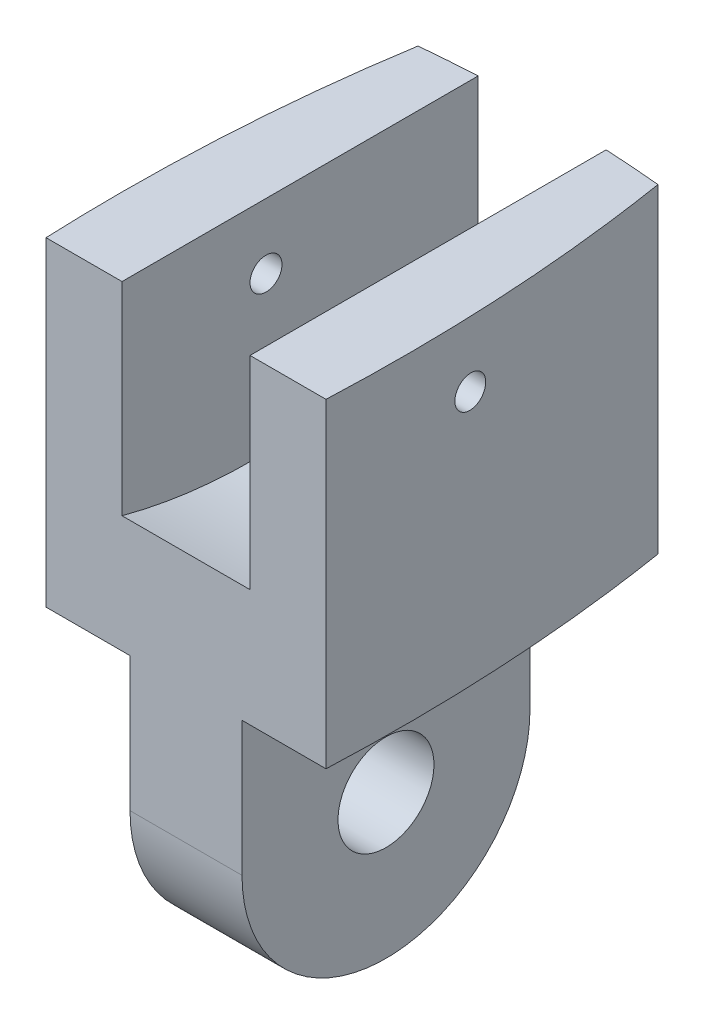
ISO-10303-21;
HEADER;
FILE_DESCRIPTION(('STEP AP214'),'2;1');
FILE_NAME('part.step','',(''),(''),'','','');
FILE_SCHEMA(('AUTOMOTIVE_DESIGN { 1 0 10303 214 1 1 1 1 }'));
ENDSEC;
DATA;
#1=APPLICATION_CONTEXT('core data for automotive mechanical design processes');
#2=APPLICATION_PROTOCOL_DEFINITION('international standard','automotive_design',2000,#1);
#3=PRODUCT_CONTEXT('',#1,'mechanical');
#4=PRODUCT('Part','Part','',(#3));
#5=PRODUCT_RELATED_PRODUCT_CATEGORY('part','',(#4));
#6=PRODUCT_DEFINITION_FORMATION('','',#4);
#7=PRODUCT_DEFINITION_CONTEXT('part definition',#1,'design');
#8=PRODUCT_DEFINITION('design','',#6,#7);
#9=PRODUCT_DEFINITION_SHAPE('','',#8);
#10=(LENGTH_UNIT() NAMED_UNIT(*) SI_UNIT(.MILLI.,.METRE.));
#11=(NAMED_UNIT(*) PLANE_ANGLE_UNIT() SI_UNIT($,.RADIAN.));
#12=(NAMED_UNIT(*) SI_UNIT($,.STERADIAN.) SOLID_ANGLE_UNIT());
#13=UNCERTAINTY_MEASURE_WITH_UNIT(LENGTH_MEASURE(1.E-05),#10,'distance_accuracy_value','');
#14=(GEOMETRIC_REPRESENTATION_CONTEXT(3) GLOBAL_UNCERTAINTY_ASSIGNED_CONTEXT((#13)) GLOBAL_UNIT_ASSIGNED_CONTEXT((#10,
#11,#12)) REPRESENTATION_CONTEXT('',''));
#15=CARTESIAN_POINT('',(0.,0.,0.));
#16=DIRECTION('',(0.,0.,1.));
#17=DIRECTION('',(1.,0.,0.));
#18=AXIS2_PLACEMENT_3D('',#15,#16,#17);
#19=CARTESIAN_POINT('',(5.13448278815076,0.,-21.0597227026028));
#20=DIRECTION('',(0.,-1.,0.));
#21=DIRECTION('',(0.,0.,-1.));
#22=AXIS2_PLACEMENT_3D('',#19,#20,#21);
#23=PLANE('',#22);
#24=DIRECTION('',(0.,0.,-1.));
#25=VECTOR('',#24,1.);
#26=CARTESIAN_POINT('',(4.,0.,-21.0597227026028));
#27=LINE('',#26,#25);
#28=CARTESIAN_POINT('',(4.,0.,11.8461538502491));
#29=VERTEX_POINT('',#28);
#30=CARTESIAN_POINT('',(4.,0.,-10.4123193736881));
#31=VERTEX_POINT('',#30);
#32=EDGE_CURVE('E211',#29,#31,#27,.T.);
#33=ORIENTED_EDGE('',*,*,#32,.F.);
#34=CARTESIAN_POINT('',(-8.75,0.,11.8461538461538));
#35=CARTESIAN_POINT('',(0.,0.,11.8461538461538));
#36=CARTESIAN_POINT('',(8.75,0.,11.8461538461538));
#37=B_SPLINE_CURVE_WITH_KNOTS('',2,(#34,#35,#36),.UNSPECIFIED.,.F.,.F.,(3,3),(0.,1.),.UNSPECIFIED.);
#38=CARTESIAN_POINT('',(8.75,0.,11.8461538461538));
#39=VERTEX_POINT('',#38);
#40=EDGE_CURVE('E318',#29,#39,#37,.T.);
#41=ORIENTED_EDGE('',*,*,#40,.T.);
#42=CARTESIAN_POINT('',(-960490.686997986,0.,278640.197183969));
#43=CARTESIAN_POINT('',(964287.125941009,0.,-264898.844652597));
#44=CARTESIAN_POINT('',(-968063.02695288,0.,251073.253230415));
#45=B_SPLINE_CURVE_WITH_KNOTS('',2,(#42,#43,#44),.UNSPECIFIED.,.F.,.F.,(3,3),(0.,1.),.UNSPECIFIED.);
#46=CARTESIAN_POINT('',(7.49999999989744,0.,-10.1538461531278));
#47=VERTEX_POINT('',#46);
#48=EDGE_CURVE('E312',#39,#47,#45,.T.);
#49=ORIENTED_EDGE('',*,*,#48,.T.);
#50=CARTESIAN_POINT('',(12478.8672852956,0.,999989.484933508));
#51=CARTESIAN_POINT('',(0.,0.,-1000010.51506649));
#52=CARTESIAN_POINT('',(-12478.8672852956,0.,999989.484933508));
#53=B_SPLINE_CURVE_WITH_KNOTS('',2,(#50,#51,#52),.UNSPECIFIED.,.F.,.F.,(3,3),(0.,1.),.UNSPECIFIED.);
#54=EDGE_CURVE('E311',#47,#31,#53,.T.);
#55=ORIENTED_EDGE('',*,*,#54,.T.);
#56=EDGE_LOOP('',(#33,#41,#49,#55));
#57=FACE_BOUND('',#56,.T.);
#58=ADVANCED_FACE('F119',(#57),#23,.F.);
#59=CARTESIAN_POINT('',(5.13448278817918,-20.,-21.059722702617));
#60=DIRECTION('',(0.,-1.,0.));
#61=DIRECTION('',(0.,0.,-1.));
#62=AXIS2_PLACEMENT_3D('',#59,#60,#61);
#63=PLANE('',#62);
#64=DIRECTION('',(0.,0.,1.));
#65=VECTOR('',#64,1.);
#66=CARTESIAN_POINT('',(3.5,-20.,-21.059722702617));
#67=LINE('',#66,#65);
#68=CARTESIAN_POINT('',(3.5,-20.,-6.15384615384616));
#69=VERTEX_POINT('',#68);
#70=CARTESIAN_POINT('',(3.5,-20.,11.8461538461538));
#71=VERTEX_POINT('',#70);
#72=EDGE_CURVE('E544',#69,#71,#67,.T.);
#73=ORIENTED_EDGE('',*,*,#72,.F.);
#74=DIRECTION('',(-1.,0.,0.));
#75=VECTOR('',#74,1.);
#76=CARTESIAN_POINT('',(5.13448278817918,-20.,-6.15384615384616));
#77=LINE('',#76,#75);
#78=CARTESIAN_POINT('',(-3.5,-20.,-6.15384615384616));
#79=VERTEX_POINT('',#78);
#80=EDGE_CURVE('E489',#69,#79,#77,.T.);
#81=ORIENTED_EDGE('',*,*,#80,.T.);
#82=DIRECTION('',(0.,0.,1.));
#83=VECTOR('',#82,1.);
#84=CARTESIAN_POINT('',(-3.5,-20.,-21.059722702617));
#85=LINE('',#84,#83);
#86=CARTESIAN_POINT('',(-3.5,-20.,11.8461538514346));
#87=VERTEX_POINT('',#86);
#88=EDGE_CURVE('E545',#79,#87,#85,.T.);
#89=ORIENTED_EDGE('',*,*,#88,.T.);
#90=CARTESIAN_POINT('',(-8.75,-20.,11.8461538461538));
#91=CARTESIAN_POINT('',(0.,-20.,11.8461538461538));
#92=CARTESIAN_POINT('',(8.75,-20.,11.8461538461538));
#93=B_SPLINE_CURVE_WITH_KNOTS('',2,(#90,#91,#92),.UNSPECIFIED.,.F.,.F.,(3,3),(0.,1.),.UNSPECIFIED.);
#94=CARTESIAN_POINT('',(-8.74999999920187,-20.,11.8461538612578));
#95=VERTEX_POINT('',#94);
#96=EDGE_CURVE('E472',#95,#87,#93,.T.);
#97=ORIENTED_EDGE('',*,*,#96,.F.);
#98=CARTESIAN_POINT('',(968063.026952878,-20.,251073.253230421));
#99=CARTESIAN_POINT('',(-964287.125941009,-20.,-264898.844652599));
#100=CARTESIAN_POINT('',(960490.686997987,-20.,278640.197183966));
#101=B_SPLINE_CURVE_WITH_KNOTS('',2,(#98,#99,#100),.UNSPECIFIED.,.F.,.F.,(3,3),(0.,1.),.UNSPECIFIED.);
#102=CARTESIAN_POINT('',(-7.50000000402118,-20.,-10.1538461277513));
#103=VERTEX_POINT('',#102);
#104=EDGE_CURVE('E534',#103,#95,#101,.T.);
#105=ORIENTED_EDGE('',*,*,#104,.F.);
#106=CARTESIAN_POINT('',(12478.8672852942,-20.,999989.484933508));
#107=CARTESIAN_POINT('',(-6.00408611717285E-10,-20.,-1000010.51506649));
#108=CARTESIAN_POINT('',(-12478.867285293,-20.,999989.484933508));
#109=B_SPLINE_CURVE_WITH_KNOTS('',2,(#106,#107,#108),.UNSPECIFIED.,.F.,.F.,(3,3),(0.,1.),.UNSPECIFIED.);
#110=CARTESIAN_POINT('',(7.50000000610207,-20.,-10.1538461533065));
#111=VERTEX_POINT('',#110);
#112=EDGE_CURVE('E527',#111,#103,#109,.T.);
#113=ORIENTED_EDGE('',*,*,#112,.F.);
#114=CARTESIAN_POINT('',(-960490.686997987,-20.,278640.197183966));
#115=CARTESIAN_POINT('',(964287.125941009,-20.,-264898.844652599));
#116=CARTESIAN_POINT('',(-968063.026952878,-20.,251073.253230421));
#117=B_SPLINE_CURVE_WITH_KNOTS('',2,(#114,#115,#116),.UNSPECIFIED.,.F.,.F.,(3,3),(0.,1.),.UNSPECIFIED.);
#118=CARTESIAN_POINT('',(8.74999999920187,-20.,11.8461538612578));
#119=VERTEX_POINT('',#118);
#120=EDGE_CURVE('E521',#119,#111,#117,.T.);
#121=ORIENTED_EDGE('',*,*,#120,.F.);
#122=EDGE_CURVE('E335',#71,#119,#93,.T.);
#123=ORIENTED_EDGE('',*,*,#122,.F.);
#124=EDGE_LOOP('',(#73,#81,#89,#97,#105,#113,#121,#123));
#125=FACE_BOUND('',#124,.T.);
#126=ADVANCED_FACE('F495',(#125),#63,.T.);
#127=CARTESIAN_POINT('',(-8.7499999991521,0.,11.8461538612444));
#128=VERTEX_POINT('',#127);
#129=CARTESIAN_POINT('',(-4.,0.,11.8461538571464));
#130=VERTEX_POINT('',#129);
#131=EDGE_CURVE('E302',#128,#130,#37,.T.);
#132=ORIENTED_EDGE('',*,*,#131,.T.);
#133=DIRECTION('',(0.,0.,-1.));
#134=VECTOR('',#133,1.);
#135=CARTESIAN_POINT('',(-4.,0.,-21.0597227026028));
#136=LINE('',#135,#134);
#137=CARTESIAN_POINT('',(-4.,0.,-10.4123193736881));
#138=VERTEX_POINT('',#137);
#139=EDGE_CURVE('E215',#130,#138,#136,.T.);
#140=ORIENTED_EDGE('',*,*,#139,.T.);
#141=CARTESIAN_POINT('',(-7.50000000385964,0.,-10.1538461284747));
#142=VERTEX_POINT('',#141);
#143=EDGE_CURVE('E298',#138,#142,#53,.T.);
#144=ORIENTED_EDGE('',*,*,#143,.T.);
#145=CARTESIAN_POINT('',(968063.02695288,0.,251073.253230415));
#146=CARTESIAN_POINT('',(-964287.125941009,0.,-264898.844652597));
#147=CARTESIAN_POINT('',(960490.686997986,0.,278640.197183969));
#148=B_SPLINE_CURVE_WITH_KNOTS('',2,(#145,#146,#147),.UNSPECIFIED.,.F.,.F.,(3,3),(0.,1.),.UNSPECIFIED.);
#149=EDGE_CURVE('E407',#142,#128,#148,.T.);
#150=ORIENTED_EDGE('',*,*,#149,.T.);
#151=EDGE_LOOP('',(#132,#140,#144,#150));
#152=FACE_BOUND('',#151,.T.);
#153=ADVANCED_FACE('F297',(#152),#23,.F.);
#154=CARTESIAN_POINT('',(-7.50000000625328,0.,-10.1538461533204));
#155=CARTESIAN_POINT('',(-7.50000000632861,-6.66666666666667,-10.1538461533037));
#156=CARTESIAN_POINT('',(-7.50000000640394,-13.3333333333333,-10.1538461532869));
#157=CARTESIAN_POINT('',(-7.50000000647927,-20.,-10.1538461532702));
#158=CARTESIAN_POINT('',(-6.8769188092913,0.,-10.2138647135521));
#159=CARTESIAN_POINT('',(-6.87691880937018,-6.66666666666667,-10.2138647135356));
#160=CARTESIAN_POINT('',(-6.87691880944906,-13.3333333333333,-10.2138647135191));
#161=CARTESIAN_POINT('',(-6.87691880952795,-20.,-10.2138647135026));
#162=CARTESIAN_POINT('',(-5.62932926094739,0.,-10.319078272971));
#163=CARTESIAN_POINT('',(-5.6293292610432,-6.66666666666666,-10.3190782729543));
#164=CARTESIAN_POINT('',(-5.62932926113901,-13.3333333333333,-10.3190782729376));
#165=CARTESIAN_POINT('',(-5.62932926123482,-20.,-10.319078272921));
#166=CARTESIAN_POINT('',(-3.75470153379456,0.,-10.4320674775611));
#167=CARTESIAN_POINT('',(-3.75470153391217,-6.66666666666667,-10.4320674775459));
#168=CARTESIAN_POINT('',(-3.75470153402977,-13.3333333333333,-10.4320674775306));
#169=CARTESIAN_POINT('',(-3.75470153414738,-20.,-10.4320674775154));
#170=CARTESIAN_POINT('',(-1.87789677760482,0.,-10.4999664647088));
#171=CARTESIAN_POINT('',(-1.87789677770733,-6.66666666666667,-10.4999664646972));
#172=CARTESIAN_POINT('',(-1.87789677780984,-13.3333333333333,-10.4999664646856));
#173=CARTESIAN_POINT('',(-1.87789677791236,-20.,-10.499966464674));
#174=CARTESIAN_POINT('',(-0.625965179133411,0.,-10.5150664921041));
#175=CARTESIAN_POINT('',(-0.625965179179066,-6.66666666666667,-10.5150664920946));
#176=CARTESIAN_POINT('',(-0.62596517922472,-13.3333333333333,-10.5150664920851));
#177=CARTESIAN_POINT('',(-0.625965179270374,-20.,-10.5150664920757));
#178=CARTESIAN_POINT('',(0.625965178984057,0.,-10.5150664921041));
#179=CARTESIAN_POINT('',(0.62596517902964,-6.66666666666667,-10.5150664920946));
#180=CARTESIAN_POINT('',(0.625965179075224,-13.3333333333333,-10.5150664920851));
#181=CARTESIAN_POINT('',(0.625965179120807,-20.,-10.5150664920757));
#182=CARTESIAN_POINT('',(1.87789637569051,0.,-10.4999664647873));
#183=CARTESIAN_POINT('',(1.87789637590126,-6.66666666666667,-10.4999664647754));
#184=CARTESIAN_POINT('',(1.877896376112,-13.3333333333333,-10.4999664647634));
#185=CARTESIAN_POINT('',(1.87789637632274,-20.,-10.4999664647514));
#186=CARTESIAN_POINT('',(3.75469993360539,0.,-10.4320675560397));
#187=CARTESIAN_POINT('',(3.75469993416297,-6.66666666666667,-10.4320675560062));
#188=CARTESIAN_POINT('',(3.75469993472056,-13.3333333333333,-10.4320675559727));
#189=CARTESIAN_POINT('',(3.75469993527815,-20.,-10.4320675559392));
#190=CARTESIAN_POINT('',(5.62933049547368,0.,-10.3190782037758));
#191=CARTESIAN_POINT('',(5.62933049635484,-6.66666666666666,-10.3190782037048));
#192=CARTESIAN_POINT('',(5.629330497236,-13.3333333333333,-10.3190782036338));
#193=CARTESIAN_POINT('',(5.62933049811716,-20.,-10.3190782035628));
#194=CARTESIAN_POINT('',(6.8769188062687,0.,-10.2138647138176));
#195=CARTESIAN_POINT('',(6.87691880726889,-6.66666666666667,-10.2138647137199));
#196=CARTESIAN_POINT('',(6.87691880826909,-13.3333333333333,-10.2138647136222));
#197=CARTESIAN_POINT('',(6.87691880926928,-20.,-10.2138647135245));
#198=CARTESIAN_POINT('',(7.49999999989744,0.,-10.1538461531278));
#199=CARTESIAN_POINT('',(7.49999999995914,-6.66666666666667,-10.1538461528579));
#200=CARTESIAN_POINT('',(7.50000000002084,-13.3333333333333,-10.1538461525881));
#201=CARTESIAN_POINT('',(7.50000000008254,-20.,-10.1538461523182));
#202=B_SPLINE_SURFACE_WITH_KNOTS('',3,3,((#154,#155,#156,#157),(#158,#159,#160,#161),(#162,#163,
#164,#165),(#166,#167,#168,#169),(#170,#171,#172,#173),(#174,#175,#176,#177),(#178,#179,#180,
#181),(#182,#183,#184,#185),(#186,#187,#188,#189),(#190,#191,#192,#193),(#194,#195,#196,#197),
(#198,#199,#200,#201)),.UNSPECIFIED.,.F.,.F.,.F.,(4,1,1,1,2,1,1,1,4),(4,4),(0.804050837385435,
0.828544482715185,0.853038128044935,0.877531773374684,0.902025418704434,0.926519064028326,
0.951012709352217,0.975506354676109,1.),(0.,1.),.UNSPECIFIED.);
#203=CARTESIAN_POINT('',(-4.,-13.9386610725496,-10.4123194402194));
#204=CARTESIAN_POINT('',(-4.,-11.6155508937913,-10.4123194402227));
#205=CARTESIAN_POINT('',(-4.,-9.29244071503304,-10.412319440226));
#206=CARTESIAN_POINT('',(-4.,-4.64622035751652,-10.4123194402326));
#207=CARTESIAN_POINT('',(-4.,-2.32311017875826,-10.4123194402359));
#208=CARTESIAN_POINT('',(-4.,0.,-10.4123194402392));
#209=B_SPLINE_CURVE_WITH_KNOTS('',3,(#203,#204,#205,#206,#207,#208),.UNSPECIFIED.,.F.,.F.,(4,2,
4),(0.,6.96933053627478,13.9386610725496),.UNSPECIFIED.);
#210=CARTESIAN_POINT('',(-4.,-10.4457546597033,-10.4123194402248));
#211=VERTEX_POINT('',#210);
#212=EDGE_CURVE('E230',#211,#138,#209,.T.);
#213=CARTESIAN_POINT('',(4.,-10.4457546625419,-10.412319434166));
#214=CARTESIAN_POINT('',(3.3348531414431,-10.4297265454407,-10.4464996853538));
#215=CARTESIAN_POINT('',(2.66917129305041,-10.417658036247,-10.4721657324565));
#216=CARTESIAN_POINT('',(1.33780678361818,-10.4015318103164,-10.5064146198566));
#217=CARTESIAN_POINT('',(0.672124552754392,-10.3974676665625,-10.5150111659667));
#218=CARTESIAN_POINT('',(-0.661387095742275,-10.3974156466644,-10.5151214626701));
#219=CARTESIAN_POINT('',(-1.32921651964448,-10.4014538394748,-10.5065800726149));
#220=CARTESIAN_POINT('',(-2.66487714336832,-10.4175800821299,-10.4723312830972));
#221=CARTESIAN_POINT('',(-3.33270791023366,-10.4296746215884,-10.4466100447384));
#222=CARTESIAN_POINT('',(-4.,-10.4457546597035,-10.4123194402244));
#223=B_SPLINE_CURVE_WITH_KNOTS('',3,(#213,#214,#215,#216,#217,#218,#219,#220,#221,#222),
.UNSPECIFIED.,.F.,.F.,(4,2,2,2,4),(0.,1.9985888549796,3.99557230981212,5.99899128492525,
8.00402602508887),.UNSPECIFIED.);
#224=CARTESIAN_POINT('',(4.,-10.4457546625417,-10.4123194341664));
#225=VERTEX_POINT('',#224);
#226=EDGE_CURVE('E220',#225,#211,#223,.T.);
#227=CARTESIAN_POINT('',(4.,-13.9386610725496,-10.412319434161));
#228=CARTESIAN_POINT('',(4.,-11.6155508937913,-10.4123194341643));
#229=CARTESIAN_POINT('',(4.,-9.29244071503304,-10.4123194341676));
#230=CARTESIAN_POINT('',(4.,-4.64622035751652,-10.4123194341742));
#231=CARTESIAN_POINT('',(4.,-2.32311017875826,-10.4123194341775));
#232=CARTESIAN_POINT('',(4.,0.,-10.4123194341808));
#233=B_SPLINE_CURVE_WITH_KNOTS('',3,(#227,#228,#229,#230,#231,#232),.UNSPECIFIED.,.F.,.F.,(4,2,
4),(0.,6.96933053627478,13.9386610725496),.UNSPECIFIED.);
#234=EDGE_CURVE('E208',#225,#31,#233,.T.);
#235=CARTESIAN_POINT('',(7.49999999989744,0.,-10.1538461531278));
#236=CARTESIAN_POINT('',(7.49999999995914,-6.66666666666667,-10.1538461528579));
#237=CARTESIAN_POINT('',(7.50000000002084,-13.3333333333333,-10.1538461525881));
#238=CARTESIAN_POINT('',(7.50000000008254,-20.,-10.1538461523182));
#239=B_SPLINE_CURVE_WITH_KNOTS('',3,(#235,#236,#237,#238),.UNSPECIFIED.,.F.,.F.,(4,4),(0.,1.),.UNSPECIFIED.);
#240=EDGE_CURVE('E326',#47,#111,#239,.T.);
#241=CARTESIAN_POINT('',(-7.50000000625328,0.,-10.1538461533204));
#242=CARTESIAN_POINT('',(-7.50000000632861,-6.66666666666667,-10.1538461533037));
#243=CARTESIAN_POINT('',(-7.50000000640394,-13.3333333333333,-10.1538461532869));
#244=CARTESIAN_POINT('',(-7.50000000647927,-20.,-10.1538461532702));
#245=B_SPLINE_CURVE_WITH_KNOTS('',3,(#241,#242,#243,#244),.UNSPECIFIED.,.F.,.F.,(4,4),(0.,1.),.UNSPECIFIED.);
#246=EDGE_CURVE('E309',#142,#103,#245,.T.);
#247=ORIENTED_EDGE('',*,*,#212,.F.);
#248=ORIENTED_EDGE('',*,*,#226,.F.);
#249=ORIENTED_EDGE('',*,*,#234,.T.);
#250=ORIENTED_EDGE('',*,*,#54,.F.);
#251=ORIENTED_EDGE('',*,*,#240,.T.);
#252=ORIENTED_EDGE('',*,*,#112,.T.);
#253=ORIENTED_EDGE('',*,*,#246,.F.);
#254=ORIENTED_EDGE('',*,*,#143,.F.);
#255=EDGE_LOOP('',(#247,#248,#249,#250,#251,#252,#253,#254));
#256=FACE_BOUND('',#255,.T.);
#257=ADVANCED_FACE('F228',(#256),#202,.T.);
#258=CARTESIAN_POINT('',(-8.74999999915212,0.,11.8461538612417));
#259=CARTESIAN_POINT('',(-8.74999999916522,-6.66666666666667,11.8461538612474));
#260=CARTESIAN_POINT('',(-8.74999999917832,-13.3333333333333,11.8461538612532));
#261=CARTESIAN_POINT('',(-8.74999999919142,-20.,11.8461538612589));
#262=CARTESIAN_POINT('',(-8.82839887033527,0.,9.96267175942704));
#263=CARTESIAN_POINT('',(-8.82839887034775,-6.66666666666667,9.96267175945363));
#264=CARTESIAN_POINT('',(-8.82839887036024,-13.3333333333333,9.96267175948022));
#265=CARTESIAN_POINT('',(-8.82839887037273,-20.,9.96267175950681));
#266=CARTESIAN_POINT('',(-8.89391384397283,0.,6.22078194046674));
#267=CARTESIAN_POINT('',(-8.89391384398609,-6.66666666666668,6.22078194053446));
#268=CARTESIAN_POINT('',(-8.89391384399936,-13.3333333333334,6.22078194060218));
#269=CARTESIAN_POINT('',(-8.89391384401263,-20.,6.2207819406699));
#270=CARTESIAN_POINT('',(-8.71833799824284,0.,0.683170366033025));
#271=CARTESIAN_POINT('',(-8.71833799826332,-6.66666666666666,0.683170366160794));
#272=CARTESIAN_POINT('',(-8.71833799828379,-13.3333333333333,0.683170366288564));
#273=CARTESIAN_POINT('',(-8.71833799830427,-20.,0.683170366416333));
#274=CARTESIAN_POINT('',(-8.26891384632663,0.,-4.77921805439389));
#275=CARTESIAN_POINT('',(-8.26891384636033,-6.66666666666666,-4.77921805420773));
#276=CARTESIAN_POINT('',(-8.26891384639403,-13.3333333333333,-4.77921805402157));
#277=CARTESIAN_POINT('',(-8.26891384642773,-20.,-4.77921805383541));
#278=CARTESIAN_POINT('',(-7.78673220759163,0.,-8.37066156534066));
#279=CARTESIAN_POINT('',(-7.78673220763816,-6.66666666666667,-8.37066156511668));
#280=CARTESIAN_POINT('',(-7.7867322076847,-13.3333333333333,-8.37066156489269));
#281=CARTESIAN_POINT('',(-7.78673220773123,-20.,-8.37066156466871));
#282=CARTESIAN_POINT('',(-7.50000000625328,0.,-10.1538461533204));
#283=CARTESIAN_POINT('',(-7.50000000632861,-6.66666666666667,-10.1538461533037));
#284=CARTESIAN_POINT('',(-7.50000000640394,-13.3333333333333,-10.1538461532869));
#285=CARTESIAN_POINT('',(-7.50000000647927,-20.,-10.1538461532702));
#286=B_SPLINE_SURFACE_WITH_KNOTS('',3,3,((#258,#259,#260,#261),(#262,#263,#264,#265),(#266,#267,
#268,#269),(#270,#271,#272,#273),(#274,#275,#276,#277),(#278,#279,#280,#281),(#282,#283,#284,
#285)),.UNSPECIFIED.,.F.,.F.,.F.,(4,1,1,1,4),(4,4),(0.516152851570945,0.588127348024568,
0.66010184447819,0.732076340931813,0.804050837385435),(0.,1.),.UNSPECIFIED.);
#287=CARTESIAN_POINT('',(-8.73199588802616,-4.07021301557208,1.84615384615384));
#288=CARTESIAN_POINT('',(-8.73199611095447,-4.1263486207463,1.84615768853024));
#289=CARTESIAN_POINT('',(-8.73221605370904,-4.18254273664591,1.85090296124685));
#290=CARTESIAN_POINT('',(-8.73286755761096,-4.2655822728275,1.86501947070341));
#291=CARTESIAN_POINT('',(-8.73313868082126,-4.29307568691622,1.87089915830496));
#292=CARTESIAN_POINT('',(-8.73378517980922,-4.34749587987484,1.88495444389628));
#293=CARTESIAN_POINT('',(-8.73416064716542,-4.37442213854088,1.89313205875208));
#294=CARTESIAN_POINT('',(-8.73543672321868,-4.45395192405377,1.92100964497264));
#295=CARTESIAN_POINT('',(-8.7364878884835,-4.50541690053934,1.94407324658259));
#296=CARTESIAN_POINT('',(-8.73894455891865,-4.60371759957563,1.99849049235292));
#297=CARTESIAN_POINT('',(-8.74035007330246,-4.65055320171338,2.02984435207025));
#298=CARTESIAN_POINT('',(-8.74345646056436,-4.73832625859891,2.09997684936209));
#299=CARTESIAN_POINT('',(-8.74515747989034,-4.7792607703602,2.1387591693543));
#300=CARTESIAN_POINT('',(-8.74878429894541,-4.85403907127963,2.22263613440035));
#301=CARTESIAN_POINT('',(-8.75071010858849,-4.88788254751584,2.26773105787809));
#302=CARTESIAN_POINT('',(-8.75471290600723,-4.9475518962301,2.36299927806206));
#303=CARTESIAN_POINT('',(-8.75679003439898,-4.97337019073952,2.41317731570978));
#304=CARTESIAN_POINT('',(-8.76101726108779,-5.0162152253759,2.51715296947016));
#305=CARTESIAN_POINT('',(-8.76316735953682,-5.03324194719071,2.57095059312186));
#306=CARTESIAN_POINT('',(-8.76746850568798,-5.05803001649822,2.68067563976032));
#307=CARTESIAN_POINT('',(-8.7696195531307,-5.06578549866404,2.73660438791591));
#308=CARTESIAN_POINT('',(-8.77385434882183,-5.07179063036411,2.84897239733114));
#309=CARTESIAN_POINT('',(-8.77593809714125,-5.07004028992871,2.90541165805203));
#310=CARTESIAN_POINT('',(-8.77998065289627,-5.05708146496697,3.01720040075864));
#311=CARTESIAN_POINT('',(-8.78193945597944,-5.04587265115214,3.07254984473468));
#312=CARTESIAN_POINT('',(-8.78568492784466,-5.01431224886005,3.18058392168385));
#313=CARTESIAN_POINT('',(-8.78747159677168,-4.99396066808312,3.23326855690134));
#314=CARTESIAN_POINT('',(-8.790835952892,-4.94470091531257,3.33445269435018));
#315=CARTESIAN_POINT('',(-8.79241372819625,-4.91579636769452,3.38295395809186));
#316=CARTESIAN_POINT('',(-8.79533544021839,-4.85024634586047,3.47441613677965));
#317=CARTESIAN_POINT('',(-8.79667937770609,-4.81360089712911,3.51737706996491));
#318=CARTESIAN_POINT('',(-8.79911592098645,-4.73363146353409,3.5965128226423));
#319=CARTESIAN_POINT('',(-8.80020866745199,-4.690311239519,3.63269143828741));
#320=CARTESIAN_POINT('',(-8.80213401508912,-4.59820668730483,3.69726243041943));
#321=CARTESIAN_POINT('',(-8.80296661688065,-4.54942237212722,3.72565482546113));
#322=CARTESIAN_POINT('',(-8.80436647097846,-4.44779855222996,3.77383368558323));
#323=CARTESIAN_POINT('',(-8.80493384414671,-4.39496090737425,3.79362407022227));
#324=CARTESIAN_POINT('',(-8.8058018510013,-4.28671118887174,3.82405441676674));
#325=CARTESIAN_POINT('',(-8.80610248513165,-4.23129911951054,3.83469439390411));
#326=CARTESIAN_POINT('',(-8.80643641355499,-4.11948903452482,3.84651947453735));
#327=CARTESIAN_POINT('',(-8.80646977757333,-4.06309127989362,3.84770704397463));
#328=CARTESIAN_POINT('',(-8.80626930855786,-3.95089692932639,3.84060001636578));
#329=CARTESIAN_POINT('',(-8.80603547570555,-3.89510033298203,3.83230542576066));
#330=CARTESIAN_POINT('',(-8.80530101241469,-3.78569592173915,3.8064709841581));
#331=CARTESIAN_POINT('',(-8.80480039947498,-3.73208796353021,3.7889317395433));
#332=CARTESIAN_POINT('',(-8.80353386853948,-3.62857823096242,3.7451073656325));
#333=CARTESIAN_POINT('',(-8.8027679505391,-3.57867645666778,3.71882223618498));
#334=CARTESIAN_POINT('',(-8.80097466907983,-3.48398868644011,3.65824997031047));
#335=CARTESIAN_POINT('',(-8.79994727363699,-3.43920331731818,3.62396185499967));
#336=CARTESIAN_POINT('',(-8.79763941984752,-3.35602497494901,3.54836037889885));
#337=CARTESIAN_POINT('',(-8.79635896108832,-3.31763201212358,3.50704700665549));
#338=CARTESIAN_POINT('',(-8.79355932247005,-3.24831450109412,3.41855474951323));
#339=CARTESIAN_POINT('',(-8.79204006587776,-3.21739236163086,3.37137398025693));
#340=CARTESIAN_POINT('',(-8.78878639220451,-3.16390730171193,3.27249790962546));
#341=CARTESIAN_POINT('',(-8.7870519748089,-3.14134439348052,3.22080260164851));
#342=CARTESIAN_POINT('',(-8.78340033033222,-3.10520567460887,3.11433775734541));
#343=CARTESIAN_POINT('',(-8.78148301162381,-3.09163439580504,3.0595666858774));
#344=CARTESIAN_POINT('',(-8.77751049015344,-3.07387938949361,2.94852831018031));
#345=CARTESIAN_POINT('',(-8.77545528667312,-3.06969571089846,2.89226099815687));
#346=CARTESIAN_POINT('',(-8.7712608071908,-3.07083285993268,2.77979455341137));
#347=CARTESIAN_POINT('',(-8.7691214854824,-3.07615892655987,2.72359547534912));
#348=CARTESIAN_POINT('',(-8.7648245065894,-3.09617388854944,2.61289050177356));
#349=CARTESIAN_POINT('',(-8.76266684931999,-3.11086282724722,2.55838461409829));
#350=CARTESIAN_POINT('',(-8.75840456629134,-3.14919317648088,2.4525945520974));
#351=CARTESIAN_POINT('',(-8.75629995860875,-3.17283759576516,2.40131146728676));
#352=CARTESIAN_POINT('',(-8.75222087037468,-3.22841026123508,2.30344405999905));
#353=CARTESIAN_POINT('',(-8.75024638470138,-3.26033818112469,2.2568595525403));
#354=CARTESIAN_POINT('',(-8.74650447861205,-3.3315588561184,2.16972385917326));
#355=CARTESIAN_POINT('',(-8.74473702026662,-3.37085025872129,2.12917156773631));
#356=CARTESIAN_POINT('',(-8.74148025525783,-3.45572011467693,2.05522919414231));
#357=CARTESIAN_POINT('',(-8.73999094111369,-3.50129839888458,2.02183891935687));
#358=CARTESIAN_POINT('',(-8.7380143469113,-3.57334755682958,1.97786812880016));
#359=CARTESIAN_POINT('',(-8.73739809410295,-3.59799301796585,1.9642241306863));
#360=CARTESIAN_POINT('',(-8.73625801169691,-3.64832286461461,1.93907069354241));
#361=CARTESIAN_POINT('',(-8.73573410107213,-3.67400631475131,1.92755938269445));
#362=CARTESIAN_POINT('',(-8.73431025499842,-3.75234375626874,1.89636009298913));
#363=CARTESIAN_POINT('',(-8.7335559804699,-3.80636556211856,1.87995758885869));
#364=CARTESIAN_POINT('',(-8.73267686557528,-3.89563713225548,1.8608827265593));
#365=CARTESIAN_POINT('',(-8.73242201480883,-3.93031497294107,1.8553672143009));
#366=CARTESIAN_POINT('',(-8.73208145641496,-4.00005859416616,1.84800157438203));
#367=CARTESIAN_POINT('',(-8.73199574868052,-4.03512437446019,1.84615144440248));
#368=CARTESIAN_POINT('',(-8.73199588802616,-4.07021301557208,1.84615384615384));
#369=B_SPLINE_CURVE_WITH_KNOTS('',3,(#287,#288,#289,#290,#291,#292,#293,#294,#295,#296,#297,
#298,#299,#300,#301,#302,#303,#304,#305,#306,#307,#308,#309,#310,#311,#312,#313,#314,#315,#316,
#317,#318,#319,#320,#321,#322,#323,#324,#325,#326,#327,#328,#329,#330,#331,#332,#333,#334,#335,
#336,#337,#338,#339,#340,#341,#342,#343,#344,#345,#346,#347,#348,#349,#350,#351,#352,#353,#354,
#355,#356,#357,#358,#359,#360,#361,#362,#363,#364,#365,#366,#367,#368),.UNSPECIFIED.,.T.,.F.,(4,
2,2,2,2,2,2,2,2,2,2,2,2,2,2,2,2,2,2,2,2,2,2,2,2,2,2,2,2,2,2,2,2,2,2,2,2,2,2,2,4),(0.,
0.168256630278762,0.252524170652635,0.336865904000102,0.505217523824589,0.673573521429838,
0.842013193054034,1.01046029622612,1.17906597973712,1.34767201443887,1.5163846591603,
1.6850971258595,1.85381546637798,2.02253366479637,2.1911804699137,2.35982671981972,
2.52837829250313,2.69692946351973,2.86540375244647,3.03387776092746,3.2023078165166,
3.37073775769514,3.53915665245848,3.70757555013933,3.8760150587535,4.04445484197914,
4.21294886125341,4.381443126927,4.55002225027418,4.71860225197133,4.88727515445207,
5.05594883762932,5.22467923998308,5.39340299687301,5.56209579343724,5.73078405229975,
5.81522675806103,5.89959499532573,6.06805133059047,6.17322344428883,6.27839549144543),.UNSPECIFIED.);
#370=CARTESIAN_POINT('',(-8.73199588802616,-4.07021301557208,1.84615384615384));
#371=VERTEX_POINT('',#370);
#372=EDGE_CURVE('E637',#371,#371,#369,.T.);
#373=CARTESIAN_POINT('',(-8.74999999915212,0.,11.8461538612417));
#374=CARTESIAN_POINT('',(-8.74999999916522,-6.66666666666667,11.8461538612474));
#375=CARTESIAN_POINT('',(-8.74999999917832,-13.3333333333333,11.8461538612532));
#376=CARTESIAN_POINT('',(-8.74999999919142,-20.,11.8461538612589));
#377=B_SPLINE_CURVE_WITH_KNOTS('',3,(#373,#374,#375,#376),.UNSPECIFIED.,.F.,.F.,(4,4),(0.,1.),.UNSPECIFIED.);
#378=EDGE_CURVE('E564',#128,#95,#377,.T.);
#379=ORIENTED_EDGE('',*,*,#372,.F.);
#380=EDGE_LOOP('',(#379));
#381=FACE_BOUND('',#380,.T.);
#382=ORIENTED_EDGE('',*,*,#149,.F.);
#383=ORIENTED_EDGE('',*,*,#246,.T.);
#384=ORIENTED_EDGE('',*,*,#104,.T.);
#385=ORIENTED_EDGE('',*,*,#378,.F.);
#386=EDGE_LOOP('',(#382,#383,#384,#385));
#387=FACE_BOUND('',#386,.T.);
#388=ADVANCED_FACE('F371',(#381,#387),#286,.T.);
#389=CARTESIAN_POINT('',(8.75,0.,11.8461538461538));
#390=DIRECTION('',(8.62161532684476E-10,0.,1.));
#391=DIRECTION('',(-1.,0.,8.62161532684476E-10));
#392=AXIS2_PLACEMENT_3D('',#389,#390,#391);
#393=PLANE('',#392);
#394=DIRECTION('',(0.,-1.,0.));
#395=VECTOR('',#394,1.);
#396=CARTESIAN_POINT('',(-4.,0.,11.8461538571464));
#397=LINE('',#396,#395);
#398=CARTESIAN_POINT('',(-4.,-12.6779096471664,11.8461538564559));
#399=VERTEX_POINT('',#398);
#400=EDGE_CURVE('E13',#130,#399,#397,.T.);
#401=ORIENTED_EDGE('',*,*,#400,.F.);
#402=ORIENTED_EDGE('',*,*,#131,.F.);
#403=ORIENTED_EDGE('',*,*,#378,.T.);
#404=ORIENTED_EDGE('',*,*,#96,.T.);
#405=DIRECTION('',(0.,-1.,0.));
#406=VECTOR('',#405,1.);
#407=CARTESIAN_POINT('',(-3.5,-28.3917436150871,11.8461538461538));
#408=LINE('',#407,#406);
#409=CARTESIAN_POINT('',(-3.5,-28.3917436150871,11.8461538461538));
#410=VERTEX_POINT('',#409);
#411=EDGE_CURVE('E145',#87,#410,#408,.T.);
#412=ORIENTED_EDGE('',*,*,#411,.T.);
#413=DIRECTION('',(-1.,0.,0.));
#414=VECTOR('',#413,1.);
#415=CARTESIAN_POINT('',(3.5,-28.3917436150871,11.8461538461538));
#416=LINE('',#415,#414);
#417=CARTESIAN_POINT('',(3.5,-28.3917436150871,11.8461538461538));
#418=VERTEX_POINT('',#417);
#419=EDGE_CURVE('E604',#418,#410,#416,.T.);
#420=ORIENTED_EDGE('',*,*,#419,.F.);
#421=DIRECTION('',(0.,-1.,0.));
#422=VECTOR('',#421,1.);
#423=CARTESIAN_POINT('',(3.5,-28.3917436150871,11.8461538461538));
#424=LINE('',#423,#422);
#425=EDGE_CURVE('E553',#71,#418,#424,.T.);
#426=ORIENTED_EDGE('',*,*,#425,.F.);
#427=ORIENTED_EDGE('',*,*,#122,.T.);
#428=CARTESIAN_POINT('',(8.75,0.,11.8461538461538));
#429=CARTESIAN_POINT('',(8.75,-6.66666666666667,11.8461538461538));
#430=CARTESIAN_POINT('',(8.75,-13.3333333333333,11.8461538461538));
#431=CARTESIAN_POINT('',(8.75,-20.,11.8461538461538));
#432=B_SPLINE_CURVE_WITH_KNOTS('',3,(#428,#429,#430,#431),.UNSPECIFIED.,.F.,.F.,(4,4),(0.,1.),.UNSPECIFIED.);
#433=EDGE_CURVE('E354',#39,#119,#432,.T.);
#434=ORIENTED_EDGE('',*,*,#433,.F.);
#435=ORIENTED_EDGE('',*,*,#40,.F.);
#436=DIRECTION('',(0.,-1.,0.));
#437=VECTOR('',#436,1.);
#438=CARTESIAN_POINT('',(4.,0.,11.8461538502491));
#439=LINE('',#438,#437);
#440=CARTESIAN_POINT('',(4.,-12.6779096490031,11.8461538502491));
#441=VERTEX_POINT('',#440);
#442=EDGE_CURVE('E456',#29,#441,#439,.T.);
#443=ORIENTED_EDGE('',*,*,#442,.T.);
#444=CARTESIAN_POINT('',(-4.,-12.6779096471664,11.8461538568011));
#445=CARTESIAN_POINT('',(-1.33333333333333,-12.6779096477174,11.8461538546171));
#446=CARTESIAN_POINT('',(1.33333333333333,-12.6779096482683,11.8461538524331));
#447=CARTESIAN_POINT('',(4.,-12.6779096488192,11.8461538502491));
#448=B_SPLINE_CURVE_WITH_KNOTS('',3,(#444,#445,#446,#447),.UNSPECIFIED.,.F.,.F.,(4,4),(0.,8.),.UNSPECIFIED.);
#449=EDGE_CURVE('E129',#399,#441,#448,.T.);
#450=ORIENTED_EDGE('',*,*,#449,.F.);
#451=EDGE_LOOP('',(#401,#402,#403,#404,#412,#420,#426,#427,#434,#435,#443,#450));
#452=FACE_BOUND('',#451,.T.);
#453=ADVANCED_FACE('F121',(#452),#393,.T.);
#454=CARTESIAN_POINT('',(7.49999999989744,0.,-10.1538461531278));
#455=CARTESIAN_POINT('',(7.49999999995914,-6.66666666666667,-10.1538461528579));
#456=CARTESIAN_POINT('',(7.50000000002084,-13.3333333333333,-10.1538461525881));
#457=CARTESIAN_POINT('',(7.50000000008254,-20.,-10.1538461523182));
#458=CARTESIAN_POINT('',(7.78673220438016,0.,-8.37066158805027));
#459=CARTESIAN_POINT('',(7.78673220443366,-6.66666666666667,-8.37066158780132));
#460=CARTESIAN_POINT('',(7.78673220448716,-13.3333333333333,-8.37066158755238));
#461=CARTESIAN_POINT('',(7.78673220454066,-20.,-8.37066158730343));
#462=CARTESIAN_POINT('',(8.26891384440654,0.,-4.77921807316861));
#463=CARTESIAN_POINT('',(8.2689138444459,-6.66666666666668,-4.77921807296207));
#464=CARTESIAN_POINT('',(8.26891384448525,-13.3333333333334,-4.77921807275552));
#465=CARTESIAN_POINT('',(8.26891384452461,-20.,-4.77921807254898));
#466=CARTESIAN_POINT('',(8.71833799762892,0.,0.683170353333955));
#467=CARTESIAN_POINT('',(8.71833799765382,-6.66666666666665,0.683170353475038));
#468=CARTESIAN_POINT('',(8.71833799767872,-13.3333333333333,0.68317035361612));
#469=CARTESIAN_POINT('',(8.71833799770362,-20.,0.683170353757203));
#470=CARTESIAN_POINT('',(8.89391384403416,0.,6.2207819340166));
#471=CARTESIAN_POINT('',(8.89391384405134,-6.66666666666668,6.22078193409037));
#472=CARTESIAN_POINT('',(8.89391384406852,-13.3333333333334,6.22078193416414));
#473=CARTESIAN_POINT('',(8.89391384408571,-20.,6.22078193423791));
#474=CARTESIAN_POINT('',(8.82839887042619,0.,9.96267175725841));
#475=CARTESIAN_POINT('',(8.82839887044274,-6.66666666666667,9.96267175728607));
#476=CARTESIAN_POINT('',(8.82839887045928,-13.3333333333333,9.96267175731372));
#477=CARTESIAN_POINT('',(8.82839887047582,-20.,9.96267175734138));
#478=CARTESIAN_POINT('',(8.75,0.,11.8461538461538));
#479=CARTESIAN_POINT('',(8.75,-6.66666666666667,11.8461538461538));
#480=CARTESIAN_POINT('',(8.75,-13.3333333333333,11.8461538461538));
#481=CARTESIAN_POINT('',(8.75,-20.,11.8461538461538));
#482=B_SPLINE_SURFACE_WITH_KNOTS('',3,3,((#454,#455,#456,#457),(#458,#459,#460,#461),(#462,#463,
#464,#465),(#466,#467,#468,#469),(#470,#471,#472,#473),(#474,#475,#476,#477),(#478,#479,#480,
#481)),.UNSPECIFIED.,.F.,.F.,.F.,(4,1,1,1,4),(4,4),(0.,0.0719744965349006,0.143948993069801,
0.215923489604702,0.287897986139602),(0.,1.),.UNSPECIFIED.);
#483=CARTESIAN_POINT('',(8.73199588802929,-4.07021301557208,1.84615384615384));
#484=CARTESIAN_POINT('',(8.73199611095733,-4.01407741039787,1.84615768853023));
#485=CARTESIAN_POINT('',(8.73221605371164,-3.95788329449826,1.85090296124685));
#486=CARTESIAN_POINT('',(8.73286755761316,-3.87484375831669,1.8650194707034));
#487=CARTESIAN_POINT('',(8.73313868082333,-3.84735034422798,1.87089915830496));
#488=CARTESIAN_POINT('',(8.73378517981102,-3.79293015126935,1.88495444389627));
#489=CARTESIAN_POINT('',(8.73416064716709,-3.76600389260331,1.89313205875207));
#490=CARTESIAN_POINT('',(8.73543672321997,-3.68647410709043,1.92100964497262));
#491=CARTESIAN_POINT('',(8.73648788848454,-3.63500913060486,1.94407324658257));
#492=CARTESIAN_POINT('',(8.73894455891922,-3.53670843156858,1.99849049235289));
#493=CARTESIAN_POINT('',(8.7403500733028,-3.48987282943083,2.02984435207021));
#494=CARTESIAN_POINT('',(8.74345646056428,-3.4020997725453,2.09997684936204));
#495=CARTESIAN_POINT('',(8.74515747989006,-3.36116526078402,2.13875916935425));
#496=CARTESIAN_POINT('',(8.74878429894478,-3.2863869598646,2.22263613440028));
#497=CARTESIAN_POINT('',(8.75071010858769,-3.25254348362839,2.267731057878));
#498=CARTESIAN_POINT('',(8.75471290600615,-3.19287413491412,2.36299927806195));
#499=CARTESIAN_POINT('',(8.75679003439777,-3.1670558404047,2.41317731570965));
#500=CARTESIAN_POINT('',(8.76101726108637,-3.12421080576832,2.51715296947));
#501=CARTESIAN_POINT('',(8.76316735953532,-3.1071840839535,2.57095059312169));
#502=CARTESIAN_POINT('',(8.76746850568636,-3.08239601464598,2.68067563976012));
#503=CARTESIAN_POINT('',(8.76961955312905,-3.07464053248015,2.7366043879157));
#504=CARTESIAN_POINT('',(8.77385434882015,-3.06863540078005,2.84897239733091));
#505=CARTESIAN_POINT('',(8.77593809713958,-3.07038574121544,2.90541165805179));
#506=CARTESIAN_POINT('',(8.77998065289466,-3.08334456617715,3.01720040075838));
#507=CARTESIAN_POINT('',(8.78193945597789,-3.09455337999196,3.07254984473443));
#508=CARTESIAN_POINT('',(8.78568492784326,-3.12611378228403,3.18058392168361));
#509=CARTESIAN_POINT('',(8.78747159677039,-3.14646536306094,3.2332685569011));
#510=CARTESIAN_POINT('',(8.79083595289094,-3.19572511583146,3.33445269434996));
#511=CARTESIAN_POINT('',(8.79241372819533,-3.22462966344951,3.38295395809165));
#512=CARTESIAN_POINT('',(8.79533544021778,-3.29017968528354,3.47441613677946));
#513=CARTESIAN_POINT('',(8.79667937770567,-3.3268251340149,3.51737706996474));
#514=CARTESIAN_POINT('',(8.79911592098641,-3.40679456760991,3.59651282264215));
#515=CARTESIAN_POINT('',(8.80020866745216,-3.450114791625,3.63269143828728));
#516=CARTESIAN_POINT('',(8.80213401508973,-3.54221934383917,3.69726243041933));
#517=CARTESIAN_POINT('',(8.80296661688149,-3.59100365901678,3.72565482546105));
#518=CARTESIAN_POINT('',(8.80436647097979,-3.69262747891405,3.77383368558318));
#519=CARTESIAN_POINT('',(8.8049338441483,-3.74546512376977,3.79362407022222));
#520=CARTESIAN_POINT('',(8.8058018510034,-3.85371484227229,3.82405441676671));
#521=CARTESIAN_POINT('',(8.80610248513402,-3.9091269116335,3.83469439390409));
#522=CARTESIAN_POINT('',(8.80643641355789,-4.02093699661923,3.84651947453735));
#523=CARTESIAN_POINT('',(8.80646977757651,-4.07733475125044,3.84770704397464));
#524=CARTESIAN_POINT('',(8.80626930856157,-4.18952910181769,3.84060001636579));
#525=CARTESIAN_POINT('',(8.80603547570953,-4.24532569816205,3.83230542576067));
#526=CARTESIAN_POINT('',(8.8053010124192,-4.35473010940494,3.80647098415811));
#527=CARTESIAN_POINT('',(8.80480039947974,-4.40833806761389,3.78893173954332));
#528=CARTESIAN_POINT('',(8.80353386854473,-4.51184780018168,3.74510736563252));
#529=CARTESIAN_POINT('',(8.80276795054458,-4.56174957447632,3.71882223618501));
#530=CARTESIAN_POINT('',(8.80097466908577,-4.656437344704,3.65824997031051));
#531=CARTESIAN_POINT('',(8.79994727364315,-4.70122271382592,3.62396185499971));
#532=CARTESIAN_POINT('',(8.79763941985408,-4.78440105619509,3.54836037889891));
#533=CARTESIAN_POINT('',(8.79635896109507,-4.82279401902052,3.50704700665555));
#534=CARTESIAN_POINT('',(8.79355932247713,-4.89211153004999,3.41855474951331));
#535=CARTESIAN_POINT('',(8.79204006588499,-4.92303366951325,3.37137398025702));
#536=CARTESIAN_POINT('',(8.788786392212,-4.97651872943218,3.27249790962557));
#537=CARTESIAN_POINT('',(8.7870519748165,-4.99908163766359,3.22080260164863));
#538=CARTESIAN_POINT('',(8.78340033034,-5.03522035653525,3.11433775734555));
#539=CARTESIAN_POINT('',(8.78148301163165,-5.04879163533909,3.05956668587756));
#540=CARTESIAN_POINT('',(8.77751049016137,-5.06654664165053,2.94852831018049));
#541=CARTESIAN_POINT('',(8.77545528668107,-5.07073032024569,2.89226099815706));
#542=CARTESIAN_POINT('',(8.77126080719875,-5.06959317121149,2.77979455341158));
#543=CARTESIAN_POINT('',(8.76912148549032,-5.06426710458432,2.72359547534934));
#544=CARTESIAN_POINT('',(8.76482450659723,-5.04425214259478,2.6128905017738));
#545=CARTESIAN_POINT('',(8.76266684932775,-5.02956320389701,2.55838461409853));
#546=CARTESIAN_POINT('',(8.75840456629892,-4.99123285466338,2.45259455209764));
#547=CARTESIAN_POINT('',(8.75629995861622,-4.96758843537912,2.401311467287));
#548=CARTESIAN_POINT('',(8.75222087038188,-4.91201576990923,2.30344405999927));
#549=CARTESIAN_POINT('',(8.75024638470843,-4.88008785001963,2.25685955254052));
#550=CARTESIAN_POINT('',(8.74650447861875,-4.80886717502595,2.16972385917346));
#551=CARTESIAN_POINT('',(8.74473702027313,-4.76957577242306,2.1291715677365));
#552=CARTESIAN_POINT('',(8.74148025526394,-4.68470591646743,2.05522919414246));
#553=CARTESIAN_POINT('',(8.73999094111958,-4.63912763225977,2.02183891935701));
#554=CARTESIAN_POINT('',(8.73801434691684,-4.56707847431478,1.97786812880028));
#555=CARTESIAN_POINT('',(8.73739809410838,-4.54243301317851,1.9642241306864));
#556=CARTESIAN_POINT('',(8.73625801170209,-4.49210316652974,1.93907069354249));
#557=CARTESIAN_POINT('',(8.73573410107718,-4.46641971639304,1.92755938269453));
#558=CARTESIAN_POINT('',(8.73431025500309,-4.3880822748756,1.89636009298919));
#559=CARTESIAN_POINT('',(8.73355598047431,-4.33406046902577,1.87995758885873));
#560=CARTESIAN_POINT('',(8.73267686557926,-4.24478889888881,1.86088272655932));
#561=CARTESIAN_POINT('',(8.73242201481265,-4.21011105820319,1.85536721430092));
#562=CARTESIAN_POINT('',(8.73208145641844,-4.14036743697805,1.84800157438203));
#563=CARTESIAN_POINT('',(8.73199574868383,-4.105301656684,1.84615144440248));
#564=CARTESIAN_POINT('',(8.73199588802929,-4.07021301557208,1.84615384615384));
#565=B_SPLINE_CURVE_WITH_KNOTS('',3,(#483,#484,#485,#486,#487,#488,#489,#490,#491,#492,#493,
#494,#495,#496,#497,#498,#499,#500,#501,#502,#503,#504,#505,#506,#507,#508,#509,#510,#511,#512,
#513,#514,#515,#516,#517,#518,#519,#520,#521,#522,#523,#524,#525,#526,#527,#528,#529,#530,#531,
#532,#533,#534,#535,#536,#537,#538,#539,#540,#541,#542,#543,#544,#545,#546,#547,#548,#549,#550,
#551,#552,#553,#554,#555,#556,#557,#558,#559,#560,#561,#562,#563,#564),.UNSPECIFIED.,.T.,.F.,(4,
2,2,2,2,2,2,2,2,2,2,2,2,2,2,2,2,2,2,2,2,2,2,2,2,2,2,2,2,2,2,2,2,2,2,2,2,2,2,2,4),(0.,
0.168256630278735,0.252524170652596,0.336865904000049,0.505217523824511,0.673573521429734,
0.842013193053885,1.01046029622592,1.17906597973687,1.34767201443858,1.51638465915997,
1.68509712585914,1.85381546637763,2.02253366479601,2.19118046991338,2.35982671981943,
2.52837829250288,2.69692946351953,2.8654037524463,3.03387776092732,3.20230781651648,
3.37073775769504,3.53915665245838,3.70757555013921,3.87601505875337,4.04445484197899,
4.21294886125321,4.38144312692677,4.55002225027391,4.71860225197102,4.88727515445174,
5.05594883762897,5.22467923998274,5.39340299687267,5.56209579343693,5.73078405229948,
5.81522675806079,5.89959499532552,6.06805133059031,6.17322344428875,6.27839549144543),.UNSPECIFIED.);
#566=CARTESIAN_POINT('',(8.73199588802929,-4.07021301557208,1.84615384615384));
#567=VERTEX_POINT('',#566);
#568=EDGE_CURVE('E640',#567,#567,#565,.T.);
#569=ORIENTED_EDGE('',*,*,#568,.F.);
#570=EDGE_LOOP('',(#569));
#571=FACE_BOUND('',#570,.T.);
#572=ORIENTED_EDGE('',*,*,#48,.F.);
#573=ORIENTED_EDGE('',*,*,#433,.T.);
#574=ORIENTED_EDGE('',*,*,#120,.T.);
#575=ORIENTED_EDGE('',*,*,#240,.F.);
#576=EDGE_LOOP('',(#572,#573,#574,#575));
#577=FACE_BOUND('',#576,.T.);
#578=ADVANCED_FACE('F356',(#571,#577),#482,.T.);
#579=CARTESIAN_POINT('',(3.5,-28.3917436150871,2.84615384615384));
#580=DIRECTION('',(-1.,0.,0.));
#581=DIRECTION('',(0.,0.,1.));
#582=AXIS2_PLACEMENT_3D('',#579,#580,#581);
#583=CYLINDRICAL_SURFACE('',#582,9.00000000000001);
#584=CARTESIAN_POINT('',(-3.5,-28.3917436150871,2.84615384615384));
#585=DIRECTION('',(1.,0.,0.));
#586=DIRECTION('',(0.,0.,-1.));
#587=AXIS2_PLACEMENT_3D('',#584,#585,#586);
#588=CIRCLE('',#587,9.00000000000001);
#589=CARTESIAN_POINT('',(-3.5,-28.3917436150871,-6.15384615384616));
#590=VERTEX_POINT('',#589);
#591=EDGE_CURVE('E231',#410,#590,#588,.T.);
#592=ORIENTED_EDGE('',*,*,#591,.T.);
#593=DIRECTION('',(-1.,0.,0.));
#594=VECTOR('',#593,1.);
#595=CARTESIAN_POINT('',(3.5,-28.3917436150871,-6.15384615384616));
#596=LINE('',#595,#594);
#597=CARTESIAN_POINT('',(3.5,-28.3917436150871,-6.15384615384616));
#598=VERTEX_POINT('',#597);
#599=EDGE_CURVE('E549',#598,#590,#596,.T.);
#600=ORIENTED_EDGE('',*,*,#599,.F.);
#601=CARTESIAN_POINT('',(3.5,-28.3917436150871,2.84615384615384));
#602=DIRECTION('',(1.,0.,0.));
#603=DIRECTION('',(0.,0.,-1.));
#604=AXIS2_PLACEMENT_3D('',#601,#602,#603);
#605=CIRCLE('',#604,9.00000000000001);
#606=EDGE_CURVE('E251',#418,#598,#605,.T.);
#607=ORIENTED_EDGE('',*,*,#606,.F.);
#608=ORIENTED_EDGE('',*,*,#419,.T.);
#609=EDGE_LOOP('',(#592,#600,#607,#608));
#610=FACE_BOUND('',#609,.T.);
#611=ADVANCED_FACE('F367',(#610),#583,.T.);
#612=CARTESIAN_POINT('',(3.5,-28.3917436150871,-6.15384615384616));
#613=DIRECTION('',(0.,0.,1.));
#614=DIRECTION('',(0.,-1.,0.));
#615=AXIS2_PLACEMENT_3D('',#612,#613,#614);
#616=PLANE('',#615);
#617=ORIENTED_EDGE('',*,*,#80,.F.);
#618=DIRECTION('',(0.,1.,0.));
#619=VECTOR('',#618,1.);
#620=CARTESIAN_POINT('',(3.5,-28.3917436150871,-6.15384615384616));
#621=LINE('',#620,#619);
#622=EDGE_CURVE('E611',#598,#69,#621,.T.);
#623=ORIENTED_EDGE('',*,*,#622,.F.);
#624=ORIENTED_EDGE('',*,*,#599,.T.);
#625=DIRECTION('',(0.,1.,0.));
#626=VECTOR('',#625,1.);
#627=CARTESIAN_POINT('',(-3.5,-28.3917436150871,-6.15384615384616));
#628=LINE('',#627,#626);
#629=EDGE_CURVE('E234',#590,#79,#628,.T.);
#630=ORIENTED_EDGE('',*,*,#629,.T.);
#631=EDGE_LOOP('',(#617,#623,#624,#630));
#632=FACE_BOUND('',#631,.T.);
#633=ADVANCED_FACE('F597',(#632),#616,.F.);
#634=CARTESIAN_POINT('',(3.5,-28.3917436150871,2.84615384615384));
#635=DIRECTION('',(1.,0.,0.));
#636=DIRECTION('',(0.,0.,-1.));
#637=AXIS2_PLACEMENT_3D('',#634,#635,#636);
#638=PLANE('',#637);
#639=CARTESIAN_POINT('',(3.5,-28.3917436150871,2.84615384615384));
#640=DIRECTION('',(1.,0.,0.));
#641=DIRECTION('',(0.,0.,-1.));
#642=AXIS2_PLACEMENT_3D('',#639,#640,#641);
#643=CIRCLE('',#642,3.);
#644=CARTESIAN_POINT('',(3.5,-28.3917436150871,-0.15384615384616));
#645=VERTEX_POINT('',#644);
#646=EDGE_CURVE('E639',#645,#645,#643,.T.);
#647=ORIENTED_EDGE('',*,*,#646,.F.);
#648=EDGE_LOOP('',(#647));
#649=FACE_BOUND('',#648,.T.);
#650=ORIENTED_EDGE('',*,*,#622,.T.);
#651=ORIENTED_EDGE('',*,*,#72,.T.);
#652=ORIENTED_EDGE('',*,*,#425,.T.);
#653=ORIENTED_EDGE('',*,*,#606,.T.);
#654=EDGE_LOOP('',(#650,#651,#652,#653));
#655=FACE_BOUND('',#654,.T.);
#656=ADVANCED_FACE('F265',(#649,#655),#638,.T.);
#657=CARTESIAN_POINT('',(-3.5,-28.3917436150871,2.84615384615384));
#658=DIRECTION('',(1.,0.,0.));
#659=DIRECTION('',(0.,0.,-1.));
#660=AXIS2_PLACEMENT_3D('',#657,#658,#659);
#661=PLANE('',#660);
#662=CARTESIAN_POINT('',(-3.5,-28.3917436150871,2.84615384615384));
#663=DIRECTION('',(1.,0.,0.));
#664=DIRECTION('',(0.,0.,-1.));
#665=AXIS2_PLACEMENT_3D('',#662,#663,#664);
#666=CIRCLE('',#665,3.);
#667=CARTESIAN_POINT('',(-3.5,-28.3917436150871,-0.15384615384616));
#668=VERTEX_POINT('',#667);
#669=EDGE_CURVE('E225',#668,#668,#666,.T.);
#670=ORIENTED_EDGE('',*,*,#669,.T.);
#671=EDGE_LOOP('',(#670));
#672=FACE_BOUND('',#671,.T.);
#673=ORIENTED_EDGE('',*,*,#88,.F.);
#674=ORIENTED_EDGE('',*,*,#629,.F.);
#675=ORIENTED_EDGE('',*,*,#591,.F.);
#676=ORIENTED_EDGE('',*,*,#411,.F.);
#677=EDGE_LOOP('',(#673,#674,#675,#676));
#678=FACE_BOUND('',#677,.T.);
#679=ADVANCED_FACE('F263',(#672,#678),#661,.F.);
#680=CARTESIAN_POINT('',(-4.,-11.2993937277612,15.9745180196187));
#681=CARTESIAN_POINT('',(-4.,-16.7666294542676,2.35698093809534));
#682=CARTESIAN_POINT('',(-4.,-10.0733291209679,-11.1860052503101));
#683=B_SPLINE_CURVE_WITH_KNOTS('',2,(#680,#681,#682),.UNSPECIFIED.,.F.,.F.,(3,3),(0.,1.),.UNSPECIFIED.);
#684=DIRECTION('',(1.,0.,0.));
#685=VECTOR('',#684,1.);
#686=SURFACE_OF_LINEAR_EXTRUSION('',#683,#685);
#687=ORIENTED_EDGE('',*,*,#226,.T.);
#688=EDGE_CURVE('E224',#399,#211,#683,.T.);
#689=ORIENTED_EDGE('',*,*,#688,.F.);
#690=ORIENTED_EDGE('',*,*,#449,.T.);
#691=CARTESIAN_POINT('',(4.,-11.2993937277612,15.9745180196187));
#692=CARTESIAN_POINT('',(4.,-16.7666294542676,2.35698093809534));
#693=CARTESIAN_POINT('',(4.,-10.0733291209679,-11.1860052503101));
#694=B_SPLINE_CURVE_WITH_KNOTS('',2,(#691,#692,#693),.UNSPECIFIED.,.F.,.F.,(3,3),(0.,1.),.UNSPECIFIED.);
#695=EDGE_CURVE('E137',#441,#225,#694,.T.);
#696=ORIENTED_EDGE('',*,*,#695,.T.);
#697=EDGE_LOOP('',(#687,#689,#690,#696));
#698=FACE_BOUND('',#697,.T.);
#699=ADVANCED_FACE('F218',(#698),#686,.F.);
#700=CARTESIAN_POINT('',(-4.,-13.7264954393161,2.37561866137481));
#701=DIRECTION('',(-1.,0.,0.));
#702=DIRECTION('',(0.,0.,1.));
#703=AXIS2_PLACEMENT_3D('',#700,#701,#702);
#704=PLANE('',#703);
#705=CARTESIAN_POINT('',(-4.,-4.07021301557208,2.84615384615384));
#706=DIRECTION('',(-1.,0.,0.));
#707=DIRECTION('',(0.,0.,1.));
#708=AXIS2_PLACEMENT_3D('',#705,#706,#707);
#709=CIRCLE('',#708,1.);
#710=CARTESIAN_POINT('',(-4.,-4.07021301557208,3.84615384615384));
#711=VERTEX_POINT('',#710);
#712=EDGE_CURVE('E644',#711,#711,#709,.T.);
#713=ORIENTED_EDGE('',*,*,#712,.T.);
#714=EDGE_LOOP('',(#713));
#715=FACE_BOUND('',#714,.T.);
#716=ORIENTED_EDGE('',*,*,#212,.T.);
#717=ORIENTED_EDGE('',*,*,#139,.F.);
#718=ORIENTED_EDGE('',*,*,#400,.T.);
#719=ORIENTED_EDGE('',*,*,#688,.T.);
#720=EDGE_LOOP('',(#716,#717,#718,#719));
#721=FACE_BOUND('',#720,.T.);
#722=ADVANCED_FACE('F262',(#715,#721),#704,.F.);
#723=CARTESIAN_POINT('',(4.,-13.7264954393161,2.37561866137481));
#724=DIRECTION('',(-1.,0.,0.));
#725=DIRECTION('',(0.,0.,1.));
#726=AXIS2_PLACEMENT_3D('',#723,#724,#725);
#727=PLANE('',#726);
#728=CARTESIAN_POINT('',(4.,-4.07021301557208,2.84615384615384));
#729=DIRECTION('',(-1.,0.,0.));
#730=DIRECTION('',(0.,0.,1.));
#731=AXIS2_PLACEMENT_3D('',#728,#729,#730);
#732=CIRCLE('',#731,1.);
#733=CARTESIAN_POINT('',(4.,-4.07021301557208,3.84615384615384));
#734=VERTEX_POINT('',#733);
#735=EDGE_CURVE('E124',#734,#734,#732,.T.);
#736=ORIENTED_EDGE('',*,*,#735,.F.);
#737=EDGE_LOOP('',(#736));
#738=FACE_BOUND('',#737,.T.);
#739=ORIENTED_EDGE('',*,*,#695,.F.);
#740=ORIENTED_EDGE('',*,*,#442,.F.);
#741=ORIENTED_EDGE('',*,*,#32,.T.);
#742=ORIENTED_EDGE('',*,*,#234,.F.);
#743=EDGE_LOOP('',(#739,#740,#741,#742));
#744=FACE_BOUND('',#743,.T.);
#745=ADVANCED_FACE('F209',(#738,#744),#727,.T.);
#746=CARTESIAN_POINT('',(3.5,-28.3917436150871,2.84615384615384));
#747=DIRECTION('',(1.,0.,0.));
#748=DIRECTION('',(0.,0.,-1.));
#749=AXIS2_PLACEMENT_3D('',#746,#747,#748);
#750=CYLINDRICAL_SURFACE('',#749,3.);
#751=ORIENTED_EDGE('',*,*,#669,.F.);
#752=EDGE_LOOP('',(#751));
#753=FACE_BOUND('',#752,.T.);
#754=ORIENTED_EDGE('',*,*,#646,.T.);
#755=EDGE_LOOP('',(#754));
#756=FACE_BOUND('',#755,.T.);
#757=ADVANCED_FACE('F658',(#753,#756),#750,.F.);
#758=CARTESIAN_POINT('',(-8.98529661274514,-4.07021301557208,2.84615384615384));
#759=DIRECTION('',(1.,0.,0.));
#760=DIRECTION('',(0.,0.,-1.));
#761=AXIS2_PLACEMENT_3D('',#758,#759,#760);
#762=CYLINDRICAL_SURFACE('',#761,1.);
#763=ORIENTED_EDGE('',*,*,#568,.T.);
#764=EDGE_LOOP('',(#763));
#765=FACE_BOUND('',#764,.T.);
#766=ORIENTED_EDGE('',*,*,#735,.T.);
#767=EDGE_LOOP('',(#766));
#768=FACE_BOUND('',#767,.T.);
#769=ADVANCED_FACE('F653',(#765,#768),#762,.F.);
#770=ORIENTED_EDGE('',*,*,#372,.T.);
#771=EDGE_LOOP('',(#770));
#772=FACE_BOUND('',#771,.T.);
#773=ORIENTED_EDGE('',*,*,#712,.F.);
#774=EDGE_LOOP('',(#773));
#775=FACE_BOUND('',#774,.T.);
#776=ADVANCED_FACE('F657',(#772,#775),#762,.F.);
#777=CLOSED_SHELL('',(#58,#126,#153,#257,#388,#453,#578,#611,#633,#656,#679,#699,#722,#745,#757,
#769,#776));
#778=MANIFOLD_SOLID_BREP('B2',#777);
#779=ADVANCED_BREP_SHAPE_REPRESENTATION('',(#18,#778),#14);
#780=SHAPE_DEFINITION_REPRESENTATION(#9,#779);
ENDSEC;
END-ISO-10303-21;
